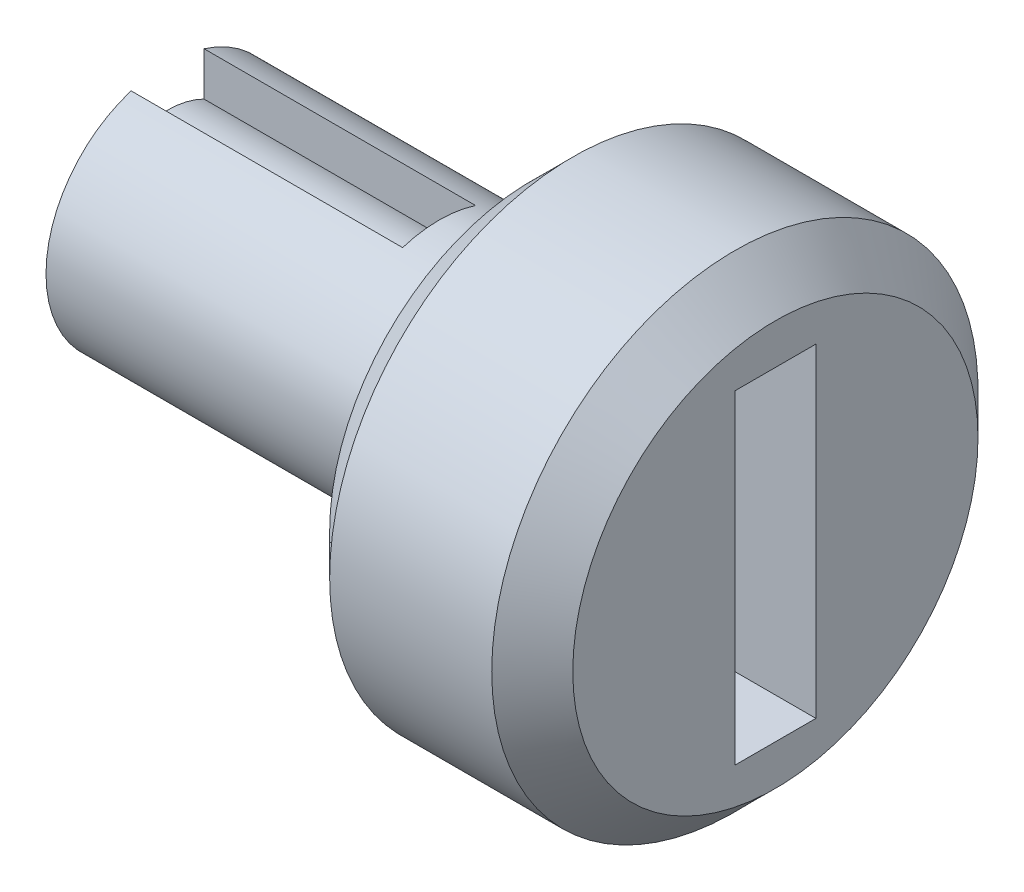
ISO-10303-21;
HEADER;
FILE_DESCRIPTION(('STEP AP214'),'2;1');
FILE_NAME('part.step','',(''),(''),'','','');
FILE_SCHEMA(('AUTOMOTIVE_DESIGN { 1 0 10303 214 1 1 1 1 }'));
ENDSEC;
DATA;
#1=APPLICATION_CONTEXT('core data for automotive mechanical design processes');
#2=APPLICATION_PROTOCOL_DEFINITION('international standard','automotive_design',2000,#1);
#3=PRODUCT_CONTEXT('',#1,'mechanical');
#4=PRODUCT('Part','Part','',(#3));
#5=PRODUCT_RELATED_PRODUCT_CATEGORY('part','',(#4));
#6=PRODUCT_DEFINITION_FORMATION('','',#4);
#7=PRODUCT_DEFINITION_CONTEXT('part definition',#1,'design');
#8=PRODUCT_DEFINITION('design','',#6,#7);
#9=PRODUCT_DEFINITION_SHAPE('','',#8);
#10=(LENGTH_UNIT() NAMED_UNIT(*) SI_UNIT(.MILLI.,.METRE.));
#11=(NAMED_UNIT(*) PLANE_ANGLE_UNIT() SI_UNIT($,.RADIAN.));
#12=(NAMED_UNIT(*) SI_UNIT($,.STERADIAN.) SOLID_ANGLE_UNIT());
#13=UNCERTAINTY_MEASURE_WITH_UNIT(LENGTH_MEASURE(1.E-05),#10,'distance_accuracy_value','');
#14=(GEOMETRIC_REPRESENTATION_CONTEXT(3) GLOBAL_UNCERTAINTY_ASSIGNED_CONTEXT((#13)) GLOBAL_UNIT_ASSIGNED_CONTEXT((#10,
#11,#12)) REPRESENTATION_CONTEXT('',''));
#15=CARTESIAN_POINT('',(0.,0.,0.));
#16=DIRECTION('',(0.,0.,1.));
#17=DIRECTION('',(1.,0.,0.));
#18=AXIS2_PLACEMENT_3D('',#15,#16,#17);
#19=CARTESIAN_POINT('',(0.,0.,0.));
#20=DIRECTION('',(1.,0.,0.));
#21=DIRECTION('',(0.,0.,-1.));
#22=AXIS2_PLACEMENT_3D('',#19,#20,#21);
#23=PLANE('',#22);
#24=CARTESIAN_POINT('',(0.,0.,0.));
#25=DIRECTION('',(-1.,0.,0.));
#26=DIRECTION('',(0.,0.,1.));
#27=AXIS2_PLACEMENT_3D('',#24,#25,#26);
#28=CIRCLE('',#27,1.2);
#29=CARTESIAN_POINT('',(0.,0.,1.2));
#30=VERTEX_POINT('',#29);
#31=EDGE_CURVE('E216',#30,#30,#28,.T.);
#32=ORIENTED_EDGE('',*,*,#31,.F.);
#33=EDGE_LOOP('',(#32));
#34=FACE_BOUND('',#33,.T.);
#35=CARTESIAN_POINT('',(0.,0.,0.));
#36=DIRECTION('',(1.,0.,0.));
#37=DIRECTION('',(0.,0.,1.));
#38=AXIS2_PLACEMENT_3D('',#35,#36,#37);
#39=CIRCLE('',#38,2.);
#40=CARTESIAN_POINT('',(0.,-1.78605710994917,0.9));
#41=VERTEX_POINT('',#40);
#42=CARTESIAN_POINT('',(0.,-1.78605710994917,-0.9));
#43=VERTEX_POINT('',#42);
#44=EDGE_CURVE('E148',#41,#43,#39,.T.);
#45=ORIENTED_EDGE('',*,*,#44,.F.);
#46=DIRECTION('',(0.,1.,0.));
#47=VECTOR('',#46,1.);
#48=CARTESIAN_POINT('',(0.,-1.78605710994917,0.9));
#49=LINE('',#48,#47);
#50=CARTESIAN_POINT('',(0.,-2.86181760425084,0.9));
#51=VERTEX_POINT('',#50);
#52=EDGE_CURVE('E140',#51,#41,#49,.T.);
#53=ORIENTED_EDGE('',*,*,#52,.F.);
#54=CARTESIAN_POINT('',(0.,0.,0.));
#55=DIRECTION('',(-1.,0.,0.));
#56=DIRECTION('',(0.,0.,1.));
#57=AXIS2_PLACEMENT_3D('',#54,#55,#56);
#58=CIRCLE('',#57,3.);
#59=CARTESIAN_POINT('',(0.,2.86181760425084,0.9));
#60=VERTEX_POINT('',#59);
#61=EDGE_CURVE('E57',#51,#60,#58,.T.);
#62=ORIENTED_EDGE('',*,*,#61,.T.);
#63=DIRECTION('',(0.,1.,0.));
#64=VECTOR('',#63,1.);
#65=CARTESIAN_POINT('',(0.,2.86181760425084,0.9));
#66=LINE('',#65,#64);
#67=CARTESIAN_POINT('',(0.,1.78605710994917,0.9));
#68=VERTEX_POINT('',#67);
#69=EDGE_CURVE('E162',#68,#60,#66,.T.);
#70=ORIENTED_EDGE('',*,*,#69,.F.);
#71=CARTESIAN_POINT('',(0.,0.,0.));
#72=DIRECTION('',(1.,0.,0.));
#73=DIRECTION('',(0.,0.,1.));
#74=AXIS2_PLACEMENT_3D('',#71,#72,#73);
#75=CIRCLE('',#74,2.);
#76=CARTESIAN_POINT('',(0.,1.78605710994917,-0.9));
#77=VERTEX_POINT('',#76);
#78=EDGE_CURVE('E165',#77,#68,#75,.T.);
#79=ORIENTED_EDGE('',*,*,#78,.F.);
#80=DIRECTION('',(0.,-1.,0.));
#81=VECTOR('',#80,1.);
#82=CARTESIAN_POINT('',(0.,2.86181760425084,-0.9));
#83=LINE('',#82,#81);
#84=CARTESIAN_POINT('',(0.,2.86181760425084,-0.9));
#85=VERTEX_POINT('',#84);
#86=EDGE_CURVE('E161',#85,#77,#83,.T.);
#87=ORIENTED_EDGE('',*,*,#86,.F.);
#88=CARTESIAN_POINT('',(0.,-2.86181760425084,-0.9));
#89=VERTEX_POINT('',#88);
#90=EDGE_CURVE('E231',#85,#89,#58,.T.);
#91=ORIENTED_EDGE('',*,*,#90,.T.);
#92=DIRECTION('',(0.,-1.,0.));
#93=VECTOR('',#92,1.);
#94=CARTESIAN_POINT('',(0.,-1.78605710994917,-0.9));
#95=LINE('',#94,#93);
#96=EDGE_CURVE('E49',#43,#89,#95,.T.);
#97=ORIENTED_EDGE('',*,*,#96,.F.);
#98=EDGE_LOOP('',(#45,#53,#62,#70,#79,#87,#91,#97));
#99=FACE_BOUND('',#98,.T.);
#100=ADVANCED_FACE('F34',(#34,#99),#23,.F.);
#101=CARTESIAN_POINT('',(0.,0.,0.));
#102=DIRECTION('',(-1.,0.,0.));
#103=DIRECTION('',(0.,0.,1.));
#104=AXIS2_PLACEMENT_3D('',#101,#102,#103);
#105=CYLINDRICAL_SURFACE('',#104,3.);
#106=ORIENTED_EDGE('',*,*,#61,.F.);
#107=DIRECTION('',(-1.,0.,0.));
#108=VECTOR('',#107,1.);
#109=CARTESIAN_POINT('',(11.171095884641,-2.86181760425084,0.9));
#110=LINE('',#109,#108);
#111=CARTESIAN_POINT('',(6.7,-2.86181760425084,0.9));
#112=VERTEX_POINT('',#111);
#113=EDGE_CURVE('E154',#112,#51,#110,.T.);
#114=ORIENTED_EDGE('',*,*,#113,.F.);
#115=CARTESIAN_POINT('',(6.7,0.,0.));
#116=DIRECTION('',(1.,0.,0.));
#117=DIRECTION('',(0.,0.,-1.));
#118=AXIS2_PLACEMENT_3D('',#115,#116,#117);
#119=CIRCLE('',#118,3.);
#120=CARTESIAN_POINT('',(6.7,-2.86181760425084,-0.9));
#121=VERTEX_POINT('',#120);
#122=EDGE_CURVE('E145',#121,#112,#119,.F.);
#123=ORIENTED_EDGE('',*,*,#122,.F.);
#124=DIRECTION('',(-1.,0.,0.));
#125=VECTOR('',#124,1.);
#126=CARTESIAN_POINT('',(11.171095884641,-2.86181760425084,-0.9));
#127=LINE('',#126,#125);
#128=EDGE_CURVE('E155',#121,#89,#127,.T.);
#129=ORIENTED_EDGE('',*,*,#128,.T.);
#130=ORIENTED_EDGE('',*,*,#90,.F.);
#131=DIRECTION('',(-1.,0.,0.));
#132=VECTOR('',#131,1.);
#133=CARTESIAN_POINT('',(11.171095884641,2.86181760425084,-0.9));
#134=LINE('',#133,#132);
#135=CARTESIAN_POINT('',(6.7,2.86181760425084,-0.9));
#136=VERTEX_POINT('',#135);
#137=EDGE_CURVE('E176',#136,#85,#134,.T.);
#138=ORIENTED_EDGE('',*,*,#137,.F.);
#139=CARTESIAN_POINT('',(6.7,0.,0.));
#140=DIRECTION('',(1.,0.,0.));
#141=DIRECTION('',(0.,0.,-1.));
#142=AXIS2_PLACEMENT_3D('',#139,#140,#141);
#143=CIRCLE('',#142,3.);
#144=CARTESIAN_POINT('',(6.7,2.86181760425084,0.9));
#145=VERTEX_POINT('',#144);
#146=EDGE_CURVE('E173',#145,#136,#143,.F.);
#147=ORIENTED_EDGE('',*,*,#146,.F.);
#148=DIRECTION('',(-1.,0.,0.));
#149=VECTOR('',#148,1.);
#150=CARTESIAN_POINT('',(11.171095884641,2.86181760425084,0.9));
#151=LINE('',#150,#149);
#152=EDGE_CURVE('E177',#145,#60,#151,.T.);
#153=ORIENTED_EDGE('',*,*,#152,.T.);
#154=EDGE_LOOP('',(#106,#114,#123,#129,#130,#138,#147,#153));
#155=FACE_BOUND('',#154,.T.);
#156=CARTESIAN_POINT('',(9.,0.,0.));
#157=DIRECTION('',(-1.,0.,0.));
#158=DIRECTION('',(0.,0.,1.));
#159=AXIS2_PLACEMENT_3D('',#156,#157,#158);
#160=CIRCLE('',#159,3.);
#161=CARTESIAN_POINT('',(9.,0.,3.));
#162=VERTEX_POINT('',#161);
#163=EDGE_CURVE('E228',#162,#162,#160,.T.);
#164=ORIENTED_EDGE('',*,*,#163,.T.);
#165=EDGE_LOOP('',(#164));
#166=FACE_BOUND('',#165,.T.);
#167=ADVANCED_FACE('F265',(#155,#166),#105,.T.);
#168=CARTESIAN_POINT('',(9.,0.,-3.));
#169=DIRECTION('',(1.,0.,0.));
#170=DIRECTION('',(0.,0.,-1.));
#171=AXIS2_PLACEMENT_3D('',#168,#169,#170);
#172=PLANE('',#171);
#173=CARTESIAN_POINT('',(9.,0.,0.));
#174=DIRECTION('',(1.,0.,0.));
#175=DIRECTION('',(0.,0.,-1.));
#176=AXIS2_PLACEMENT_3D('',#173,#174,#175);
#177=CIRCLE('',#176,5.00000000000001);
#178=CARTESIAN_POINT('',(9.,0.,-5.00000000000001));
#179=VERTEX_POINT('',#178);
#180=EDGE_CURVE('E13',#179,#179,#177,.F.);
#181=ORIENTED_EDGE('',*,*,#180,.T.);
#182=EDGE_LOOP('',(#181));
#183=FACE_BOUND('',#182,.T.);
#184=ORIENTED_EDGE('',*,*,#163,.F.);
#185=EDGE_LOOP('',(#184));
#186=FACE_BOUND('',#185,.T.);
#187=ADVANCED_FACE('F254',(#183,#186),#172,.F.);
#188=CARTESIAN_POINT('',(0.,0.,0.));
#189=DIRECTION('',(-1.,0.,0.));
#190=DIRECTION('',(0.,0.,1.));
#191=AXIS2_PLACEMENT_3D('',#188,#189,#190);
#192=CYLINDRICAL_SURFACE('',#191,6.);
#193=CARTESIAN_POINT('',(14.,0.,0.));
#194=DIRECTION('',(-1.,0.,0.));
#195=DIRECTION('',(0.,0.,1.));
#196=AXIS2_PLACEMENT_3D('',#193,#194,#195);
#197=CIRCLE('',#196,6.);
#198=CARTESIAN_POINT('',(14.,0.,6.));
#199=VERTEX_POINT('',#198);
#200=EDGE_CURVE('E237',#199,#199,#197,.T.);
#201=ORIENTED_EDGE('',*,*,#200,.T.);
#202=EDGE_LOOP('',(#201));
#203=FACE_BOUND('',#202,.T.);
#204=CARTESIAN_POINT('',(10.,0.,0.));
#205=DIRECTION('',(1.,0.,0.));
#206=DIRECTION('',(0.,0.,-1.));
#207=AXIS2_PLACEMENT_3D('',#204,#205,#206);
#208=CIRCLE('',#207,6.);
#209=CARTESIAN_POINT('',(10.,0.,-6.));
#210=VERTEX_POINT('',#209);
#211=EDGE_CURVE('E234',#210,#210,#208,.T.);
#212=ORIENTED_EDGE('',*,*,#211,.T.);
#213=EDGE_LOOP('',(#212));
#214=FACE_BOUND('',#213,.T.);
#215=ADVANCED_FACE('F251',(#203,#214),#192,.T.);
#216=CARTESIAN_POINT('',(15.,0.,-6.));
#217=DIRECTION('',(-1.,0.,0.));
#218=DIRECTION('',(0.,0.,1.));
#219=AXIS2_PLACEMENT_3D('',#216,#217,#218);
#220=PLANE('',#219);
#221=CARTESIAN_POINT('',(15.,0.,0.));
#222=DIRECTION('',(-1.,0.,0.));
#223=DIRECTION('',(0.,0.,1.));
#224=AXIS2_PLACEMENT_3D('',#221,#222,#223);
#225=CIRCLE('',#224,4.99999999999999);
#226=CARTESIAN_POINT('',(15.,0.,5.));
#227=VERTEX_POINT('',#226);
#228=EDGE_CURVE('E42',#227,#227,#225,.F.);
#229=ORIENTED_EDGE('',*,*,#228,.T.);
#230=EDGE_LOOP('',(#229));
#231=FACE_BOUND('',#230,.T.);
#232=DIRECTION('',(0.,0.,1.));
#233=VECTOR('',#232,1.);
#234=CARTESIAN_POINT('',(15.,4.,1.));
#235=LINE('',#234,#233);
#236=CARTESIAN_POINT('',(15.,4.,-0.999999999999999));
#237=VERTEX_POINT('',#236);
#238=CARTESIAN_POINT('',(15.,4.,1.));
#239=VERTEX_POINT('',#238);
#240=EDGE_CURVE('E206',#237,#239,#235,.T.);
#241=ORIENTED_EDGE('',*,*,#240,.F.);
#242=DIRECTION('',(0.,1.,0.));
#243=VECTOR('',#242,1.);
#244=CARTESIAN_POINT('',(15.,-4.,-0.999999999999999));
#245=LINE('',#244,#243);
#246=CARTESIAN_POINT('',(15.,-4.,-0.999999999999999));
#247=VERTEX_POINT('',#246);
#248=EDGE_CURVE('E190',#247,#237,#245,.T.);
#249=ORIENTED_EDGE('',*,*,#248,.F.);
#250=DIRECTION('',(0.,0.,-1.));
#251=VECTOR('',#250,1.);
#252=CARTESIAN_POINT('',(15.,-4.,1.));
#253=LINE('',#252,#251);
#254=CARTESIAN_POINT('',(15.,-4.,1.));
#255=VERTEX_POINT('',#254);
#256=EDGE_CURVE('E195',#255,#247,#253,.T.);
#257=ORIENTED_EDGE('',*,*,#256,.F.);
#258=DIRECTION('',(0.,-1.,0.));
#259=VECTOR('',#258,1.);
#260=CARTESIAN_POINT('',(15.,-4.,1.));
#261=LINE('',#260,#259);
#262=EDGE_CURVE('E209',#239,#255,#261,.T.);
#263=ORIENTED_EDGE('',*,*,#262,.F.);
#264=EDGE_LOOP('',(#241,#249,#257,#263));
#265=FACE_BOUND('',#264,.T.);
#266=ADVANCED_FACE('F242',(#231,#265),#220,.F.);
#267=CARTESIAN_POINT('',(9.,0.,-3.));
#268=DIRECTION('',(1.,0.,0.));
#269=DIRECTION('',(0.,0.,-1.));
#270=AXIS2_PLACEMENT_3D('',#267,#268,#269);
#271=PLANE('',#270);
#272=CARTESIAN_POINT('',(9.,0.,0.));
#273=DIRECTION('',(1.,0.,0.));
#274=DIRECTION('',(0.,0.,-1.));
#275=AXIS2_PLACEMENT_3D('',#272,#273,#274);
#276=CIRCLE('',#275,1.2);
#277=CARTESIAN_POINT('',(9.,0.,-1.2));
#278=VERTEX_POINT('',#277);
#279=EDGE_CURVE('E225',#278,#278,#276,.F.);
#280=ORIENTED_EDGE('',*,*,#279,.T.);
#281=EDGE_LOOP('',(#280));
#282=FACE_BOUND('',#281,.T.);
#283=ADVANCED_FACE('F280',(#282),#271,.F.);
#284=CARTESIAN_POINT('',(12.3941125496954,0.,0.));
#285=DIRECTION('',(-1.,0.,0.));
#286=DIRECTION('',(0.,0.,1.));
#287=AXIS2_PLACEMENT_3D('',#284,#285,#286);
#288=CYLINDRICAL_SURFACE('',#287,1.2);
#289=ORIENTED_EDGE('',*,*,#31,.T.);
#290=EDGE_LOOP('',(#289));
#291=FACE_BOUND('',#290,.T.);
#292=ORIENTED_EDGE('',*,*,#279,.F.);
#293=EDGE_LOOP('',(#292));
#294=FACE_BOUND('',#293,.T.);
#295=ADVANCED_FACE('F283',(#291,#294),#288,.F.);
#296=CARTESIAN_POINT('',(11.,-4.,-0.999999999999999));
#297=DIRECTION('',(0.,0.,-1.));
#298=DIRECTION('',(-1.,0.,0.));
#299=AXIS2_PLACEMENT_3D('',#296,#297,#298);
#300=PLANE('',#299);
#301=ORIENTED_EDGE('',*,*,#248,.T.);
#302=DIRECTION('',(1.,0.,0.));
#303=VECTOR('',#302,1.);
#304=CARTESIAN_POINT('',(11.,4.,-0.999999999999999));
#305=LINE('',#304,#303);
#306=CARTESIAN_POINT('',(11.,4.,-0.999999999999999));
#307=VERTEX_POINT('',#306);
#308=EDGE_CURVE('E204',#307,#237,#305,.T.);
#309=ORIENTED_EDGE('',*,*,#308,.F.);
#310=DIRECTION('',(0.,1.,0.));
#311=VECTOR('',#310,1.);
#312=CARTESIAN_POINT('',(11.,-4.,-0.999999999999999));
#313=LINE('',#312,#311);
#314=CARTESIAN_POINT('',(11.,-4.,-0.999999999999999));
#315=VERTEX_POINT('',#314);
#316=EDGE_CURVE('E191',#315,#307,#313,.T.);
#317=ORIENTED_EDGE('',*,*,#316,.F.);
#318=DIRECTION('',(1.,0.,0.));
#319=VECTOR('',#318,1.);
#320=CARTESIAN_POINT('',(11.,-4.,-0.999999999999999));
#321=LINE('',#320,#319);
#322=EDGE_CURVE('E214',#315,#247,#321,.T.);
#323=ORIENTED_EDGE('',*,*,#322,.T.);
#324=EDGE_LOOP('',(#301,#309,#317,#323));
#325=FACE_BOUND('',#324,.T.);
#326=ADVANCED_FACE('F287',(#325),#300,.F.);
#327=CARTESIAN_POINT('',(11.,-4.,1.));
#328=DIRECTION('',(0.,-1.,0.));
#329=DIRECTION('',(0.,0.,-1.));
#330=AXIS2_PLACEMENT_3D('',#327,#328,#329);
#331=PLANE('',#330);
#332=ORIENTED_EDGE('',*,*,#256,.T.);
#333=ORIENTED_EDGE('',*,*,#322,.F.);
#334=DIRECTION('',(0.,0.,-1.));
#335=VECTOR('',#334,1.);
#336=CARTESIAN_POINT('',(11.,-4.,1.));
#337=LINE('',#336,#335);
#338=CARTESIAN_POINT('',(11.,-4.,1.));
#339=VERTEX_POINT('',#338);
#340=EDGE_CURVE('E201',#339,#315,#337,.T.);
#341=ORIENTED_EDGE('',*,*,#340,.F.);
#342=DIRECTION('',(1.,0.,0.));
#343=VECTOR('',#342,1.);
#344=CARTESIAN_POINT('',(11.,-4.,1.));
#345=LINE('',#344,#343);
#346=EDGE_CURVE('E217',#339,#255,#345,.T.);
#347=ORIENTED_EDGE('',*,*,#346,.T.);
#348=EDGE_LOOP('',(#332,#333,#341,#347));
#349=FACE_BOUND('',#348,.T.);
#350=ADVANCED_FACE('F291',(#349),#331,.F.);
#351=CARTESIAN_POINT('',(11.,-4.,1.));
#352=DIRECTION('',(0.,0.,1.));
#353=DIRECTION('',(1.,0.,0.));
#354=AXIS2_PLACEMENT_3D('',#351,#352,#353);
#355=PLANE('',#354);
#356=ORIENTED_EDGE('',*,*,#262,.T.);
#357=ORIENTED_EDGE('',*,*,#346,.F.);
#358=DIRECTION('',(0.,-1.,0.));
#359=VECTOR('',#358,1.);
#360=CARTESIAN_POINT('',(11.,-4.,1.));
#361=LINE('',#360,#359);
#362=CARTESIAN_POINT('',(11.,4.,1.));
#363=VERTEX_POINT('',#362);
#364=EDGE_CURVE('E198',#363,#339,#361,.T.);
#365=ORIENTED_EDGE('',*,*,#364,.F.);
#366=DIRECTION('',(1.,0.,0.));
#367=VECTOR('',#366,1.);
#368=CARTESIAN_POINT('',(11.,4.,1.));
#369=LINE('',#368,#367);
#370=EDGE_CURVE('E219',#363,#239,#369,.T.);
#371=ORIENTED_EDGE('',*,*,#370,.T.);
#372=EDGE_LOOP('',(#356,#357,#365,#371));
#373=FACE_BOUND('',#372,.T.);
#374=ADVANCED_FACE('F296',(#373),#355,.F.);
#375=CARTESIAN_POINT('',(11.,4.,1.));
#376=DIRECTION('',(0.,1.,0.));
#377=DIRECTION('',(0.,0.,1.));
#378=AXIS2_PLACEMENT_3D('',#375,#376,#377);
#379=PLANE('',#378);
#380=ORIENTED_EDGE('',*,*,#240,.T.);
#381=ORIENTED_EDGE('',*,*,#370,.F.);
#382=DIRECTION('',(0.,0.,1.));
#383=VECTOR('',#382,1.);
#384=CARTESIAN_POINT('',(11.,4.,1.));
#385=LINE('',#384,#383);
#386=EDGE_CURVE('E194',#307,#363,#385,.T.);
#387=ORIENTED_EDGE('',*,*,#386,.F.);
#388=ORIENTED_EDGE('',*,*,#308,.T.);
#389=EDGE_LOOP('',(#380,#381,#387,#388));
#390=FACE_BOUND('',#389,.T.);
#391=ADVANCED_FACE('F293',(#390),#379,.F.);
#392=CARTESIAN_POINT('',(11.,4.,-0.999999999999999));
#393=DIRECTION('',(-1.,0.,0.));
#394=DIRECTION('',(0.,0.,1.));
#395=AXIS2_PLACEMENT_3D('',#392,#393,#394);
#396=PLANE('',#395);
#397=ORIENTED_EDGE('',*,*,#316,.T.);
#398=ORIENTED_EDGE('',*,*,#386,.T.);
#399=ORIENTED_EDGE('',*,*,#364,.T.);
#400=ORIENTED_EDGE('',*,*,#340,.T.);
#401=EDGE_LOOP('',(#397,#398,#399,#400));
#402=FACE_BOUND('',#401,.T.);
#403=ADVANCED_FACE('F248',(#402),#396,.F.);
#404=CARTESIAN_POINT('',(14.,0.,0.));
#405=DIRECTION('',(-1.,0.,0.));
#406=DIRECTION('',(0.,0.,1.));
#407=AXIS2_PLACEMENT_3D('',#404,#405,#406);
#408=CONICAL_SURFACE('',#407,6.,0.78539816339745);
#409=ORIENTED_EDGE('',*,*,#228,.F.);
#410=EDGE_LOOP('',(#409));
#411=FACE_BOUND('',#410,.T.);
#412=ORIENTED_EDGE('',*,*,#200,.F.);
#413=EDGE_LOOP('',(#412));
#414=FACE_BOUND('',#413,.T.);
#415=ADVANCED_FACE('F245',(#411,#414),#408,.T.);
#416=CARTESIAN_POINT('',(9.,0.,0.));
#417=DIRECTION('',(1.,0.,0.));
#418=DIRECTION('',(0.,0.,-1.));
#419=AXIS2_PLACEMENT_3D('',#416,#417,#418);
#420=CONICAL_SURFACE('',#419,5.00000000000001,0.785398163397446);
#421=ORIENTED_EDGE('',*,*,#211,.F.);
#422=EDGE_LOOP('',(#421));
#423=FACE_BOUND('',#422,.T.);
#424=ORIENTED_EDGE('',*,*,#180,.F.);
#425=EDGE_LOOP('',(#424));
#426=FACE_BOUND('',#425,.T.);
#427=ADVANCED_FACE('F36',(#423,#426),#420,.T.);
#428=CARTESIAN_POINT('',(6.7,0.,-3.));
#429=DIRECTION('',(1.,0.,0.));
#430=DIRECTION('',(0.,0.,-1.));
#431=AXIS2_PLACEMENT_3D('',#428,#429,#430);
#432=PLANE('',#431);
#433=ORIENTED_EDGE('',*,*,#146,.T.);
#434=DIRECTION('',(0.,-1.,0.));
#435=VECTOR('',#434,1.);
#436=CARTESIAN_POINT('',(6.7,2.86181760425084,-0.9));
#437=LINE('',#436,#435);
#438=CARTESIAN_POINT('',(6.7,1.78605710994917,-0.9));
#439=VERTEX_POINT('',#438);
#440=EDGE_CURVE('E164',#136,#439,#437,.T.);
#441=ORIENTED_EDGE('',*,*,#440,.T.);
#442=CARTESIAN_POINT('',(6.7,0.,0.));
#443=DIRECTION('',(1.,0.,0.));
#444=DIRECTION('',(0.,0.,-1.));
#445=AXIS2_PLACEMENT_3D('',#442,#443,#444);
#446=CIRCLE('',#445,2.);
#447=CARTESIAN_POINT('',(6.7,1.78605710994917,0.9));
#448=VERTEX_POINT('',#447);
#449=EDGE_CURVE('E182',#439,#448,#446,.T.);
#450=ORIENTED_EDGE('',*,*,#449,.T.);
#451=DIRECTION('',(0.,1.,0.));
#452=VECTOR('',#451,1.);
#453=CARTESIAN_POINT('',(6.7,2.86181760425084,0.9));
#454=LINE('',#453,#452);
#455=EDGE_CURVE('E178',#448,#145,#454,.T.);
#456=ORIENTED_EDGE('',*,*,#455,.T.);
#457=EDGE_LOOP('',(#433,#441,#450,#456));
#458=FACE_BOUND('',#457,.T.);
#459=ADVANCED_FACE('F260',(#458),#432,.F.);
#460=CARTESIAN_POINT('',(11.171095884641,2.86181760425084,-0.9));
#461=DIRECTION('',(0.,0.,-1.));
#462=DIRECTION('',(-1.,0.,0.));
#463=AXIS2_PLACEMENT_3D('',#460,#461,#462);
#464=PLANE('',#463);
#465=ORIENTED_EDGE('',*,*,#137,.T.);
#466=ORIENTED_EDGE('',*,*,#86,.T.);
#467=DIRECTION('',(-1.,0.,0.));
#468=VECTOR('',#467,1.);
#469=CARTESIAN_POINT('',(11.171095884641,1.78605710994917,-0.9));
#470=LINE('',#469,#468);
#471=EDGE_CURVE('E172',#439,#77,#470,.T.);
#472=ORIENTED_EDGE('',*,*,#471,.F.);
#473=ORIENTED_EDGE('',*,*,#440,.F.);
#474=EDGE_LOOP('',(#465,#466,#472,#473));
#475=FACE_BOUND('',#474,.T.);
#476=ADVANCED_FACE('F309',(#475),#464,.F.);
#477=CARTESIAN_POINT('',(11.171095884641,0.,0.));
#478=DIRECTION('',(-1.,0.,0.));
#479=DIRECTION('',(0.,0.,1.));
#480=AXIS2_PLACEMENT_3D('',#477,#478,#479);
#481=CYLINDRICAL_SURFACE('',#480,2.);
#482=ORIENTED_EDGE('',*,*,#471,.T.);
#483=ORIENTED_EDGE('',*,*,#78,.T.);
#484=DIRECTION('',(-1.,0.,0.));
#485=VECTOR('',#484,1.);
#486=CARTESIAN_POINT('',(11.171095884641,1.78605710994917,0.9));
#487=LINE('',#486,#485);
#488=EDGE_CURVE('E181',#448,#68,#487,.T.);
#489=ORIENTED_EDGE('',*,*,#488,.F.);
#490=ORIENTED_EDGE('',*,*,#449,.F.);
#491=EDGE_LOOP('',(#482,#483,#489,#490));
#492=FACE_BOUND('',#491,.T.);
#493=ADVANCED_FACE('F313',(#492),#481,.T.);
#494=CARTESIAN_POINT('',(11.171095884641,2.86181760425084,0.9));
#495=DIRECTION('',(0.,0.,1.));
#496=DIRECTION('',(1.,0.,0.));
#497=AXIS2_PLACEMENT_3D('',#494,#495,#496);
#498=PLANE('',#497);
#499=ORIENTED_EDGE('',*,*,#488,.T.);
#500=ORIENTED_EDGE('',*,*,#69,.T.);
#501=ORIENTED_EDGE('',*,*,#152,.F.);
#502=ORIENTED_EDGE('',*,*,#455,.F.);
#503=EDGE_LOOP('',(#499,#500,#501,#502));
#504=FACE_BOUND('',#503,.T.);
#505=ADVANCED_FACE('F317',(#504),#498,.F.);
#506=CARTESIAN_POINT('',(6.7,0.,-3.));
#507=DIRECTION('',(1.,0.,0.));
#508=DIRECTION('',(0.,0.,-1.));
#509=AXIS2_PLACEMENT_3D('',#506,#507,#508);
#510=PLANE('',#509);
#511=ORIENTED_EDGE('',*,*,#122,.T.);
#512=DIRECTION('',(0.,1.,0.));
#513=VECTOR('',#512,1.);
#514=CARTESIAN_POINT('',(6.7,-1.78605710994917,0.9));
#515=LINE('',#514,#513);
#516=CARTESIAN_POINT('',(6.7,-1.78605710994917,0.9));
#517=VERTEX_POINT('',#516);
#518=EDGE_CURVE('E138',#112,#517,#515,.T.);
#519=ORIENTED_EDGE('',*,*,#518,.T.);
#520=CARTESIAN_POINT('',(6.7,0.,0.));
#521=DIRECTION('',(1.,0.,0.));
#522=DIRECTION('',(0.,0.,-1.));
#523=AXIS2_PLACEMENT_3D('',#520,#521,#522);
#524=CIRCLE('',#523,2.);
#525=CARTESIAN_POINT('',(6.7,-1.78605710994917,-0.9));
#526=VERTEX_POINT('',#525);
#527=EDGE_CURVE('E125',#517,#526,#524,.T.);
#528=ORIENTED_EDGE('',*,*,#527,.T.);
#529=DIRECTION('',(0.,-1.,0.));
#530=VECTOR('',#529,1.);
#531=CARTESIAN_POINT('',(6.7,-1.78605710994917,-0.9));
#532=LINE('',#531,#530);
#533=EDGE_CURVE('E156',#526,#121,#532,.T.);
#534=ORIENTED_EDGE('',*,*,#533,.T.);
#535=EDGE_LOOP('',(#511,#519,#528,#534));
#536=FACE_BOUND('',#535,.T.);
#537=ADVANCED_FACE('F143',(#536),#510,.F.);
#538=CARTESIAN_POINT('',(11.171095884641,-1.78605710994917,0.9));
#539=DIRECTION('',(0.,0.,1.));
#540=DIRECTION('',(0.,-1.,0.));
#541=AXIS2_PLACEMENT_3D('',#538,#539,#540);
#542=PLANE('',#541);
#543=ORIENTED_EDGE('',*,*,#113,.T.);
#544=ORIENTED_EDGE('',*,*,#52,.T.);
#545=DIRECTION('',(-1.,0.,0.));
#546=VECTOR('',#545,1.);
#547=CARTESIAN_POINT('',(11.171095884641,-1.78605710994917,0.9));
#548=LINE('',#547,#546);
#549=EDGE_CURVE('E129',#517,#41,#548,.T.);
#550=ORIENTED_EDGE('',*,*,#549,.F.);
#551=ORIENTED_EDGE('',*,*,#518,.F.);
#552=EDGE_LOOP('',(#543,#544,#550,#551));
#553=FACE_BOUND('',#552,.T.);
#554=ADVANCED_FACE('F137',(#553),#542,.F.);
#555=CARTESIAN_POINT('',(11.171095884641,0.,0.));
#556=DIRECTION('',(-1.,0.,0.));
#557=DIRECTION('',(0.,0.,1.));
#558=AXIS2_PLACEMENT_3D('',#555,#556,#557);
#559=CYLINDRICAL_SURFACE('',#558,2.);
#560=ORIENTED_EDGE('',*,*,#549,.T.);
#561=ORIENTED_EDGE('',*,*,#44,.T.);
#562=DIRECTION('',(-1.,0.,0.));
#563=VECTOR('',#562,1.);
#564=CARTESIAN_POINT('',(11.171095884641,-1.78605710994917,-0.9));
#565=LINE('',#564,#563);
#566=EDGE_CURVE('E131',#526,#43,#565,.T.);
#567=ORIENTED_EDGE('',*,*,#566,.F.);
#568=ORIENTED_EDGE('',*,*,#527,.F.);
#569=EDGE_LOOP('',(#560,#561,#567,#568));
#570=FACE_BOUND('',#569,.T.);
#571=ADVANCED_FACE('F127',(#570),#559,.T.);
#572=CARTESIAN_POINT('',(11.171095884641,-1.78605710994917,-0.9));
#573=DIRECTION('',(0.,0.,-1.));
#574=DIRECTION('',(-1.,0.,0.));
#575=AXIS2_PLACEMENT_3D('',#572,#573,#574);
#576=PLANE('',#575);
#577=ORIENTED_EDGE('',*,*,#566,.T.);
#578=ORIENTED_EDGE('',*,*,#96,.T.);
#579=ORIENTED_EDGE('',*,*,#128,.F.);
#580=ORIENTED_EDGE('',*,*,#533,.F.);
#581=EDGE_LOOP('',(#577,#578,#579,#580));
#582=FACE_BOUND('',#581,.T.);
#583=ADVANCED_FACE('F328',(#582),#576,.F.);
#584=CLOSED_SHELL('',(#100,#167,#187,#215,#266,#283,#295,#326,#350,#374,#391,#403,#415,#427,
#459,#476,#493,#505,#537,#554,#571,#583));
#585=MANIFOLD_SOLID_BREP('B2',#584);
#586=ADVANCED_BREP_SHAPE_REPRESENTATION('',(#18,#585),#14);
#587=SHAPE_DEFINITION_REPRESENTATION(#9,#586);
ENDSEC;
END-ISO-10303-21;
